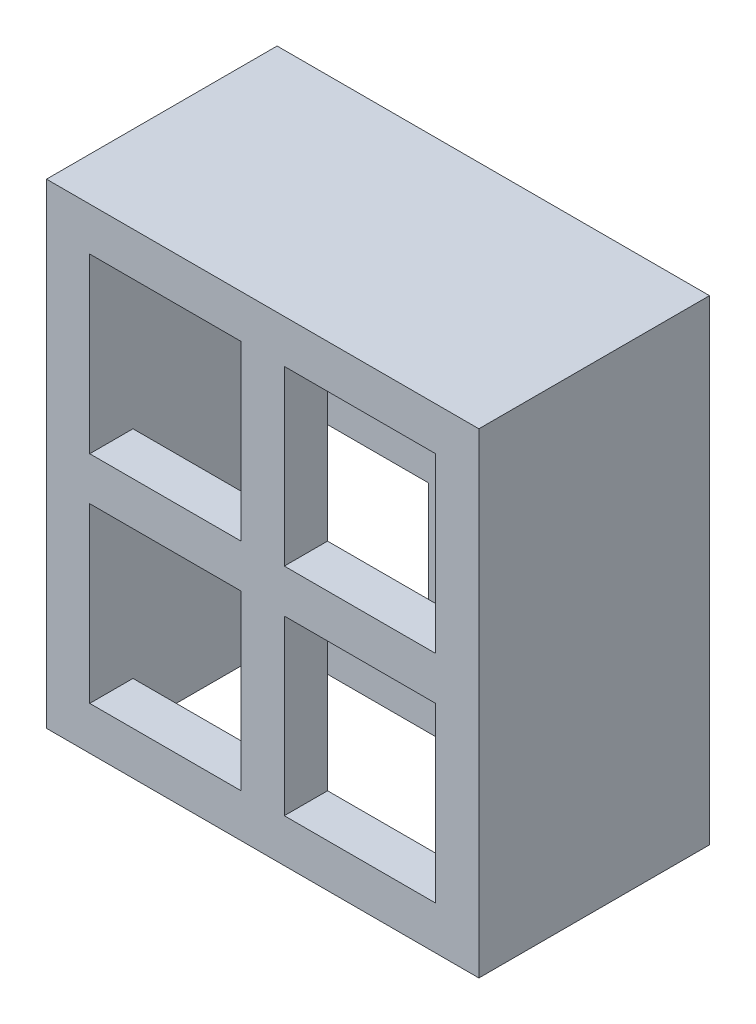
ISO-10303-21;
HEADER;
FILE_DESCRIPTION(('STEP AP214'),'2;1');
FILE_NAME('part.step','',(''),(''),'','','');
FILE_SCHEMA(('AUTOMOTIVE_DESIGN { 1 0 10303 214 1 1 1 1 }'));
ENDSEC;
DATA;
#1=APPLICATION_CONTEXT('core data for automotive mechanical design processes');
#2=APPLICATION_PROTOCOL_DEFINITION('international standard','automotive_design',2000,#1);
#3=PRODUCT_CONTEXT('',#1,'mechanical');
#4=PRODUCT('Part','Part','',(#3));
#5=PRODUCT_RELATED_PRODUCT_CATEGORY('part','',(#4));
#6=PRODUCT_DEFINITION_FORMATION('','',#4);
#7=PRODUCT_DEFINITION_CONTEXT('part definition',#1,'design');
#8=PRODUCT_DEFINITION('design','',#6,#7);
#9=PRODUCT_DEFINITION_SHAPE('','',#8);
#10=(LENGTH_UNIT() NAMED_UNIT(*) SI_UNIT(.MILLI.,.METRE.));
#11=(NAMED_UNIT(*) PLANE_ANGLE_UNIT() SI_UNIT($,.RADIAN.));
#12=(NAMED_UNIT(*) SI_UNIT($,.STERADIAN.) SOLID_ANGLE_UNIT());
#13=UNCERTAINTY_MEASURE_WITH_UNIT(LENGTH_MEASURE(1.E-05),#10,'distance_accuracy_value','');
#14=(GEOMETRIC_REPRESENTATION_CONTEXT(3) GLOBAL_UNCERTAINTY_ASSIGNED_CONTEXT((#13)) GLOBAL_UNIT_ASSIGNED_CONTEXT((#10,
#11,#12)) REPRESENTATION_CONTEXT('',''));
#15=CARTESIAN_POINT('',(0.,0.,0.));
#16=DIRECTION('',(0.,0.,1.));
#17=DIRECTION('',(1.,0.,0.));
#18=AXIS2_PLACEMENT_3D('',#15,#16,#17);
#19=CARTESIAN_POINT('',(-32.3492358096452,16.5,22.6983026995238));
#20=DIRECTION('',(0.,0.,1.));
#21=DIRECTION('',(1.,0.,0.));
#22=AXIS2_PLACEMENT_3D('',#19,#20,#21);
#23=PLANE('',#22);
#24=DIRECTION('',(0.,-1.,0.));
#25=VECTOR('',#24,1.);
#26=CARTESIAN_POINT('',(-20.3492358096452,16.5,22.6983026995238));
#27=LINE('',#26,#25);
#28=CARTESIAN_POINT('',(-20.3492358096452,3.,22.6983026995238));
#29=VERTEX_POINT('',#28);
#30=CARTESIAN_POINT('',(-20.3492358096452,1.5,22.6983026995238));
#31=VERTEX_POINT('',#30);
#32=EDGE_CURVE('E441',#29,#31,#27,.T.);
#33=ORIENTED_EDGE('',*,*,#32,.T.);
#34=DIRECTION('',(-1.,0.,0.));
#35=VECTOR('',#34,1.);
#36=CARTESIAN_POINT('',(-32.3492358096452,1.5,22.6983026995238));
#37=LINE('',#36,#35);
#38=CARTESIAN_POINT('',(-32.3492358096452,1.5,22.6983026995238));
#39=VERTEX_POINT('',#38);
#40=EDGE_CURVE('E287',#31,#39,#37,.T.);
#41=ORIENTED_EDGE('',*,*,#40,.T.);
#42=DIRECTION('',(0.,-1.,0.));
#43=VECTOR('',#42,1.);
#44=CARTESIAN_POINT('',(-32.3492358096452,16.5,22.6983026995238));
#45=LINE('',#44,#43);
#46=CARTESIAN_POINT('',(-32.3492358096452,3.,22.6983026995238));
#47=VERTEX_POINT('',#46);
#48=EDGE_CURVE('E437',#47,#39,#45,.T.);
#49=ORIENTED_EDGE('',*,*,#48,.F.);
#50=DIRECTION('',(1.,0.,0.));
#51=VECTOR('',#50,1.);
#52=CARTESIAN_POINT('',(-32.3492358096452,3.,22.6983026995238));
#53=LINE('',#52,#51);
#54=CARTESIAN_POINT('',(-27.0992358096452,3.,22.6983026995238));
#55=VERTEX_POINT('',#54);
#56=EDGE_CURVE('E417',#47,#55,#53,.T.);
#57=ORIENTED_EDGE('',*,*,#56,.T.);
#58=DIRECTION('',(0.,1.,0.));
#59=VECTOR('',#58,1.);
#60=CARTESIAN_POINT('',(-27.0992358096452,16.5,22.6983026995238));
#61=LINE('',#60,#59);
#62=CARTESIAN_POINT('',(-27.0992358096452,9.,22.6983026995238));
#63=VERTEX_POINT('',#62);
#64=EDGE_CURVE('E420',#55,#63,#61,.T.);
#65=ORIENTED_EDGE('',*,*,#64,.T.);
#66=DIRECTION('',(-1.,0.,0.));
#67=VECTOR('',#66,1.);
#68=CARTESIAN_POINT('',(-32.3492358096452,9.,22.6983026995238));
#69=LINE('',#68,#67);
#70=CARTESIAN_POINT('',(-32.3492358096452,9.,22.6983026995238));
#71=VERTEX_POINT('',#70);
#72=EDGE_CURVE('E423',#63,#71,#69,.T.);
#73=ORIENTED_EDGE('',*,*,#72,.T.);
#74=CARTESIAN_POINT('',(-32.3492358096452,10.5,22.6983026995238));
#75=VERTEX_POINT('',#74);
#76=EDGE_CURVE('E439',#75,#71,#45,.T.);
#77=ORIENTED_EDGE('',*,*,#76,.F.);
#78=DIRECTION('',(1.,0.,0.));
#79=VECTOR('',#78,1.);
#80=CARTESIAN_POINT('',(-32.3492358096452,10.5,22.6983026995238));
#81=LINE('',#80,#79);
#82=CARTESIAN_POINT('',(-27.0992358096452,10.5,22.6983026995238));
#83=VERTEX_POINT('',#82);
#84=EDGE_CURVE('E402',#75,#83,#81,.T.);
#85=ORIENTED_EDGE('',*,*,#84,.T.);
#86=DIRECTION('',(0.,1.,0.));
#87=VECTOR('',#86,1.);
#88=CARTESIAN_POINT('',(-27.0992358096452,16.5,22.6983026995238));
#89=LINE('',#88,#87);
#90=CARTESIAN_POINT('',(-27.0992358096452,16.5,22.6983026995238));
#91=VERTEX_POINT('',#90);
#92=EDGE_CURVE('E393',#83,#91,#89,.T.);
#93=ORIENTED_EDGE('',*,*,#92,.T.);
#94=DIRECTION('',(-1.,0.,0.));
#95=VECTOR('',#94,1.);
#96=CARTESIAN_POINT('',(-32.3492358096452,16.5,22.6983026995238));
#97=LINE('',#96,#95);
#98=CARTESIAN_POINT('',(-25.5992358096452,16.5,22.6983026995238));
#99=VERTEX_POINT('',#98);
#100=EDGE_CURVE('E433',#99,#91,#97,.T.);
#101=ORIENTED_EDGE('',*,*,#100,.F.);
#102=DIRECTION('',(0.,-1.,0.));
#103=VECTOR('',#102,1.);
#104=CARTESIAN_POINT('',(-25.5992358096452,16.5,22.6983026995238));
#105=LINE('',#104,#103);
#106=CARTESIAN_POINT('',(-25.5992358096452,10.5,22.6983026995238));
#107=VERTEX_POINT('',#106);
#108=EDGE_CURVE('E399',#99,#107,#105,.T.);
#109=ORIENTED_EDGE('',*,*,#108,.T.);
#110=DIRECTION('',(1.,0.,0.));
#111=VECTOR('',#110,1.);
#112=CARTESIAN_POINT('',(-32.3492358096452,10.5,22.6983026995238));
#113=LINE('',#112,#111);
#114=CARTESIAN_POINT('',(-20.3492358096452,10.5,22.6983026995238));
#115=VERTEX_POINT('',#114);
#116=EDGE_CURVE('E405',#107,#115,#113,.T.);
#117=ORIENTED_EDGE('',*,*,#116,.T.);
#118=CARTESIAN_POINT('',(-20.3492358096452,9.,22.6983026995238));
#119=VERTEX_POINT('',#118);
#120=EDGE_CURVE('E440',#115,#119,#27,.T.);
#121=ORIENTED_EDGE('',*,*,#120,.T.);
#122=DIRECTION('',(-1.,0.,0.));
#123=VECTOR('',#122,1.);
#124=CARTESIAN_POINT('',(-32.3492358096452,9.,22.6983026995238));
#125=LINE('',#124,#123);
#126=CARTESIAN_POINT('',(-25.5992358096452,9.,22.6983026995238));
#127=VERTEX_POINT('',#126);
#128=EDGE_CURVE('E411',#119,#127,#125,.T.);
#129=ORIENTED_EDGE('',*,*,#128,.T.);
#130=DIRECTION('',(0.,-1.,0.));
#131=VECTOR('',#130,1.);
#132=CARTESIAN_POINT('',(-25.5992358096452,16.5,22.6983026995238));
#133=LINE('',#132,#131);
#134=CARTESIAN_POINT('',(-25.5992358096452,3.,22.6983026995238));
#135=VERTEX_POINT('',#134);
#136=EDGE_CURVE('E414',#127,#135,#133,.T.);
#137=ORIENTED_EDGE('',*,*,#136,.T.);
#138=DIRECTION('',(1.,0.,0.));
#139=VECTOR('',#138,1.);
#140=CARTESIAN_POINT('',(-32.3492358096452,3.,22.6983026995238));
#141=LINE('',#140,#139);
#142=EDGE_CURVE('E408',#135,#29,#141,.T.);
#143=ORIENTED_EDGE('',*,*,#142,.T.);
#144=EDGE_LOOP('',(#33,#41,#49,#57,#65,#73,#77,#85,#93,#101,#109,#117,#121,#129,#137,#143));
#145=FACE_BOUND('',#144,.T.);
#146=ADVANCED_FACE('F33',(#145),#23,.F.);
#147=CARTESIAN_POINT('',(-32.3492358096452,16.5,17.6983026995238));
#148=DIRECTION('',(0.,0.,-1.));
#149=DIRECTION('',(-1.,0.,0.));
#150=AXIS2_PLACEMENT_3D('',#147,#148,#149);
#151=PLANE('',#150);
#152=DIRECTION('',(0.,-1.,0.));
#153=VECTOR('',#152,1.);
#154=CARTESIAN_POINT('',(-32.3492358096452,16.5,17.6983026995238));
#155=LINE('',#154,#153);
#156=CARTESIAN_POINT('',(-32.3492358096452,3.,17.6983026995238));
#157=VERTEX_POINT('',#156);
#158=CARTESIAN_POINT('',(-32.3492358096452,1.5,17.6983026995238));
#159=VERTEX_POINT('',#158);
#160=EDGE_CURVE('E436',#157,#159,#155,.T.);
#161=ORIENTED_EDGE('',*,*,#160,.T.);
#162=DIRECTION('',(1.,0.,0.));
#163=VECTOR('',#162,1.);
#164=CARTESIAN_POINT('',(-32.3492358096452,1.5,17.6983026995238));
#165=LINE('',#164,#163);
#166=CARTESIAN_POINT('',(-20.3492358096452,1.5,17.6983026995238));
#167=VERTEX_POINT('',#166);
#168=EDGE_CURVE('E11',#159,#167,#165,.T.);
#169=ORIENTED_EDGE('',*,*,#168,.T.);
#170=DIRECTION('',(0.,-1.,0.));
#171=VECTOR('',#170,1.);
#172=CARTESIAN_POINT('',(-20.3492358096452,16.5,17.6983026995238));
#173=LINE('',#172,#171);
#174=CARTESIAN_POINT('',(-20.3492358096452,3.,17.6983026995238));
#175=VERTEX_POINT('',#174);
#176=EDGE_CURVE('E445',#175,#167,#173,.T.);
#177=ORIENTED_EDGE('',*,*,#176,.F.);
#178=DIRECTION('',(-1.,0.,0.));
#179=VECTOR('',#178,1.);
#180=CARTESIAN_POINT('',(-32.3492358096452,3.,17.6983026995238));
#181=LINE('',#180,#179);
#182=CARTESIAN_POINT('',(-25.5992358096452,3.,17.6983026995238));
#183=VERTEX_POINT('',#182);
#184=EDGE_CURVE('E304',#175,#183,#181,.T.);
#185=ORIENTED_EDGE('',*,*,#184,.T.);
#186=DIRECTION('',(0.,1.,0.));
#187=VECTOR('',#186,1.);
#188=CARTESIAN_POINT('',(-25.5992358096452,16.5,17.6983026995238));
#189=LINE('',#188,#187);
#190=CARTESIAN_POINT('',(-25.5992358096452,9.,17.6983026995238));
#191=VERTEX_POINT('',#190);
#192=EDGE_CURVE('E307',#183,#191,#189,.T.);
#193=ORIENTED_EDGE('',*,*,#192,.T.);
#194=DIRECTION('',(1.,0.,0.));
#195=VECTOR('',#194,1.);
#196=CARTESIAN_POINT('',(-32.3492358096452,9.,17.6983026995238));
#197=LINE('',#196,#195);
#198=CARTESIAN_POINT('',(-20.3492358096452,9.,17.6983026995238));
#199=VERTEX_POINT('',#198);
#200=EDGE_CURVE('E310',#191,#199,#197,.T.);
#201=ORIENTED_EDGE('',*,*,#200,.T.);
#202=CARTESIAN_POINT('',(-20.3492358096452,10.5,17.6983026995238));
#203=VERTEX_POINT('',#202);
#204=EDGE_CURVE('E444',#203,#199,#173,.T.);
#205=ORIENTED_EDGE('',*,*,#204,.F.);
#206=DIRECTION('',(-1.,0.,0.));
#207=VECTOR('',#206,1.);
#208=CARTESIAN_POINT('',(-32.3492358096452,10.5,17.6983026995238));
#209=LINE('',#208,#207);
#210=CARTESIAN_POINT('',(-25.5992358096452,10.5,17.6983026995238));
#211=VERTEX_POINT('',#210);
#212=EDGE_CURVE('E301',#203,#211,#209,.T.);
#213=ORIENTED_EDGE('',*,*,#212,.T.);
#214=DIRECTION('',(0.,1.,0.));
#215=VECTOR('',#214,1.);
#216=CARTESIAN_POINT('',(-25.5992358096452,16.5,17.6983026995238));
#217=LINE('',#216,#215);
#218=CARTESIAN_POINT('',(-25.5992358096452,16.5,17.6983026995238));
#219=VERTEX_POINT('',#218);
#220=EDGE_CURVE('E396',#211,#219,#217,.T.);
#221=ORIENTED_EDGE('',*,*,#220,.T.);
#222=DIRECTION('',(1.,0.,0.));
#223=VECTOR('',#222,1.);
#224=CARTESIAN_POINT('',(-32.3492358096452,16.5,17.6983026995238));
#225=LINE('',#224,#223);
#226=CARTESIAN_POINT('',(-27.0992358096452,16.5,17.6983026995238));
#227=VERTEX_POINT('',#226);
#228=EDGE_CURVE('E428',#227,#219,#225,.T.);
#229=ORIENTED_EDGE('',*,*,#228,.F.);
#230=DIRECTION('',(0.,-1.,0.));
#231=VECTOR('',#230,1.);
#232=CARTESIAN_POINT('',(-27.0992358096452,16.5,17.6983026995238));
#233=LINE('',#232,#231);
#234=CARTESIAN_POINT('',(-27.0992358096452,10.5,17.6983026995238));
#235=VERTEX_POINT('',#234);
#236=EDGE_CURVE('E383',#227,#235,#233,.T.);
#237=ORIENTED_EDGE('',*,*,#236,.T.);
#238=DIRECTION('',(-1.,0.,0.));
#239=VECTOR('',#238,1.);
#240=CARTESIAN_POINT('',(-32.3492358096452,10.5,17.6983026995238));
#241=LINE('',#240,#239);
#242=CARTESIAN_POINT('',(-32.3492358096452,10.5,17.6983026995238));
#243=VERTEX_POINT('',#242);
#244=EDGE_CURVE('E293',#235,#243,#241,.T.);
#245=ORIENTED_EDGE('',*,*,#244,.T.);
#246=CARTESIAN_POINT('',(-32.3492358096452,9.,17.6983026995238));
#247=VERTEX_POINT('',#246);
#248=EDGE_CURVE('E324',#243,#247,#155,.T.);
#249=ORIENTED_EDGE('',*,*,#248,.T.);
#250=DIRECTION('',(1.,0.,0.));
#251=VECTOR('',#250,1.);
#252=CARTESIAN_POINT('',(-32.3492358096452,9.,17.6983026995238));
#253=LINE('',#252,#251);
#254=CARTESIAN_POINT('',(-27.0992358096452,9.,17.6983026995238));
#255=VERTEX_POINT('',#254);
#256=EDGE_CURVE('E41',#247,#255,#253,.T.);
#257=ORIENTED_EDGE('',*,*,#256,.T.);
#258=DIRECTION('',(0.,-1.,0.));
#259=VECTOR('',#258,1.);
#260=CARTESIAN_POINT('',(-27.0992358096452,16.5,17.6983026995238));
#261=LINE('',#260,#259);
#262=CARTESIAN_POINT('',(-27.0992358096452,3.,17.6983026995238));
#263=VERTEX_POINT('',#262);
#264=EDGE_CURVE('E316',#255,#263,#261,.T.);
#265=ORIENTED_EDGE('',*,*,#264,.T.);
#266=DIRECTION('',(-1.,0.,0.));
#267=VECTOR('',#266,1.);
#268=CARTESIAN_POINT('',(-32.3492358096452,3.,17.6983026995238));
#269=LINE('',#268,#267);
#270=EDGE_CURVE('E313',#263,#157,#269,.T.);
#271=ORIENTED_EDGE('',*,*,#270,.T.);
#272=EDGE_LOOP('',(#161,#169,#177,#185,#193,#201,#205,#213,#221,#229,#237,#245,#249,#257,#265,#271));
#273=FACE_BOUND('',#272,.T.);
#274=ADVANCED_FACE('F322',(#273),#151,.F.);
#275=CARTESIAN_POINT('',(-33.8492358096452,18.,24.1983026995238));
#276=DIRECTION('',(1.,0.,0.));
#277=DIRECTION('',(0.,0.,-1.));
#278=AXIS2_PLACEMENT_3D('',#275,#276,#277);
#279=PLANE('',#278);
#280=DIRECTION('',(0.,-1.,0.));
#281=VECTOR('',#280,1.);
#282=CARTESIAN_POINT('',(-33.8492358096452,18.,16.1983026995238));
#283=LINE('',#282,#281);
#284=CARTESIAN_POINT('',(-33.8492358096452,18.,16.1983026995238));
#285=VERTEX_POINT('',#284);
#286=CARTESIAN_POINT('',(-33.8492358096452,1.5,16.1983026995238));
#287=VERTEX_POINT('',#286);
#288=EDGE_CURVE('E295',#285,#287,#283,.T.);
#289=ORIENTED_EDGE('',*,*,#288,.T.);
#290=DIRECTION('',(0.,0.,1.));
#291=VECTOR('',#290,1.);
#292=CARTESIAN_POINT('',(-33.8492358096452,1.5,22.6983026995238));
#293=LINE('',#292,#291);
#294=CARTESIAN_POINT('',(-33.8492358096452,1.5,24.1983026995238));
#295=VERTEX_POINT('',#294);
#296=EDGE_CURVE('E278',#287,#295,#293,.T.);
#297=ORIENTED_EDGE('',*,*,#296,.T.);
#298=DIRECTION('',(0.,-1.,0.));
#299=VECTOR('',#298,1.);
#300=CARTESIAN_POINT('',(-33.8492358096452,18.,24.1983026995238));
#301=LINE('',#300,#299);
#302=CARTESIAN_POINT('',(-33.8492358096452,18.,24.1983026995238));
#303=VERTEX_POINT('',#302);
#304=EDGE_CURVE('E286',#303,#295,#301,.T.);
#305=ORIENTED_EDGE('',*,*,#304,.F.);
#306=DIRECTION('',(0.,0.,1.));
#307=VECTOR('',#306,1.);
#308=CARTESIAN_POINT('',(-33.8492358096452,18.,24.1983026995238));
#309=LINE('',#308,#307);
#310=EDGE_CURVE('E449',#285,#303,#309,.T.);
#311=ORIENTED_EDGE('',*,*,#310,.F.);
#312=EDGE_LOOP('',(#289,#297,#305,#311));
#313=FACE_BOUND('',#312,.T.);
#314=ADVANCED_FACE('F35',(#313),#279,.F.);
#315=CARTESIAN_POINT('',(-33.8492358096452,18.,24.1983026995238));
#316=DIRECTION('',(0.,0.,-1.));
#317=DIRECTION('',(-1.,0.,0.));
#318=AXIS2_PLACEMENT_3D('',#315,#316,#317);
#319=PLANE('',#318);
#320=DIRECTION('',(1.,0.,0.));
#321=VECTOR('',#320,1.);
#322=CARTESIAN_POINT('',(-32.3492358096452,3.,24.1983026995238));
#323=LINE('',#322,#321);
#324=CARTESIAN_POINT('',(-32.3492358096452,3.,24.1983026995238));
#325=VERTEX_POINT('',#324);
#326=CARTESIAN_POINT('',(-27.0992358096452,3.,24.1983026995238));
#327=VERTEX_POINT('',#326);
#328=EDGE_CURVE('E549',#325,#327,#323,.T.);
#329=ORIENTED_EDGE('',*,*,#328,.F.);
#330=DIRECTION('',(0.,-1.,0.));
#331=VECTOR('',#330,1.);
#332=CARTESIAN_POINT('',(-32.3492358096452,9.,24.1983026995238));
#333=LINE('',#332,#331);
#334=CARTESIAN_POINT('',(-32.3492358096452,9.,24.1983026995238));
#335=VERTEX_POINT('',#334);
#336=EDGE_CURVE('E48',#335,#325,#333,.T.);
#337=ORIENTED_EDGE('',*,*,#336,.F.);
#338=DIRECTION('',(-1.,0.,0.));
#339=VECTOR('',#338,1.);
#340=CARTESIAN_POINT('',(-32.3492358096452,9.,24.1983026995238));
#341=LINE('',#340,#339);
#342=CARTESIAN_POINT('',(-27.0992358096452,9.,24.1983026995238));
#343=VERTEX_POINT('',#342);
#344=EDGE_CURVE('E344',#343,#335,#341,.T.);
#345=ORIENTED_EDGE('',*,*,#344,.F.);
#346=DIRECTION('',(0.,1.,0.));
#347=VECTOR('',#346,1.);
#348=CARTESIAN_POINT('',(-27.0992358096452,9.,24.1983026995238));
#349=LINE('',#348,#347);
#350=EDGE_CURVE('E551',#327,#343,#349,.T.);
#351=ORIENTED_EDGE('',*,*,#350,.F.);
#352=EDGE_LOOP('',(#329,#337,#345,#351));
#353=FACE_BOUND('',#352,.T.);
#354=DIRECTION('',(1.,0.,0.));
#355=VECTOR('',#354,1.);
#356=CARTESIAN_POINT('',(-25.5992358096452,3.,24.1983026995238));
#357=LINE('',#356,#355);
#358=CARTESIAN_POINT('',(-25.5992358096452,3.,24.1983026995238));
#359=VERTEX_POINT('',#358);
#360=CARTESIAN_POINT('',(-20.3492358096452,3.,24.1983026995238));
#361=VERTEX_POINT('',#360);
#362=EDGE_CURVE('E340',#359,#361,#357,.T.);
#363=ORIENTED_EDGE('',*,*,#362,.F.);
#364=DIRECTION('',(0.,-1.,0.));
#365=VECTOR('',#364,1.);
#366=CARTESIAN_POINT('',(-25.5992358096452,9.,24.1983026995238));
#367=LINE('',#366,#365);
#368=CARTESIAN_POINT('',(-25.5992358096452,9.,24.1983026995238));
#369=VERTEX_POINT('',#368);
#370=EDGE_CURVE('E56',#369,#359,#367,.T.);
#371=ORIENTED_EDGE('',*,*,#370,.F.);
#372=DIRECTION('',(-1.,0.,0.));
#373=VECTOR('',#372,1.);
#374=CARTESIAN_POINT('',(-25.5992358096452,9.,24.1983026995238));
#375=LINE('',#374,#373);
#376=CARTESIAN_POINT('',(-20.3492358096452,9.,24.1983026995238));
#377=VERTEX_POINT('',#376);
#378=EDGE_CURVE('E510',#377,#369,#375,.T.);
#379=ORIENTED_EDGE('',*,*,#378,.F.);
#380=DIRECTION('',(0.,1.,0.));
#381=VECTOR('',#380,1.);
#382=CARTESIAN_POINT('',(-20.3492358096452,9.,24.1983026995238));
#383=LINE('',#382,#381);
#384=EDGE_CURVE('E522',#361,#377,#383,.T.);
#385=ORIENTED_EDGE('',*,*,#384,.F.);
#386=EDGE_LOOP('',(#363,#371,#379,#385));
#387=FACE_BOUND('',#386,.T.);
#388=DIRECTION('',(1.,0.,0.));
#389=VECTOR('',#388,1.);
#390=CARTESIAN_POINT('',(-25.5992358096452,10.5,24.1983026995238));
#391=LINE('',#390,#389);
#392=CARTESIAN_POINT('',(-25.5992358096452,10.5,24.1983026995238));
#393=VERTEX_POINT('',#392);
#394=CARTESIAN_POINT('',(-20.3492358096452,10.5,24.1983026995238));
#395=VERTEX_POINT('',#394);
#396=EDGE_CURVE('E489',#393,#395,#391,.T.);
#397=ORIENTED_EDGE('',*,*,#396,.F.);
#398=DIRECTION('',(0.,-1.,0.));
#399=VECTOR('',#398,1.);
#400=CARTESIAN_POINT('',(-25.5992358096452,16.5,24.1983026995238));
#401=LINE('',#400,#399);
#402=CARTESIAN_POINT('',(-25.5992358096452,16.5,24.1983026995238));
#403=VERTEX_POINT('',#402);
#404=EDGE_CURVE('E487',#403,#393,#401,.T.);
#405=ORIENTED_EDGE('',*,*,#404,.F.);
#406=DIRECTION('',(-1.,0.,0.));
#407=VECTOR('',#406,1.);
#408=CARTESIAN_POINT('',(-25.5992358096452,16.5,24.1983026995238));
#409=LINE('',#408,#407);
#410=CARTESIAN_POINT('',(-20.3492358096452,16.5,24.1983026995238));
#411=VERTEX_POINT('',#410);
#412=EDGE_CURVE('E477',#411,#403,#409,.T.);
#413=ORIENTED_EDGE('',*,*,#412,.F.);
#414=DIRECTION('',(0.,1.,0.));
#415=VECTOR('',#414,1.);
#416=CARTESIAN_POINT('',(-20.3492358096452,16.5,24.1983026995238));
#417=LINE('',#416,#415);
#418=EDGE_CURVE('E493',#395,#411,#417,.T.);
#419=ORIENTED_EDGE('',*,*,#418,.F.);
#420=EDGE_LOOP('',(#397,#405,#413,#419));
#421=FACE_BOUND('',#420,.T.);
#422=DIRECTION('',(1.,0.,0.));
#423=VECTOR('',#422,1.);
#424=CARTESIAN_POINT('',(-32.3492358096452,10.5,24.1983026995238));
#425=LINE('',#424,#423);
#426=CARTESIAN_POINT('',(-32.3492358096452,10.5,24.1983026995238));
#427=VERTEX_POINT('',#426);
#428=CARTESIAN_POINT('',(-27.0992358096452,10.5,24.1983026995238));
#429=VERTEX_POINT('',#428);
#430=EDGE_CURVE('E371',#427,#429,#425,.T.);
#431=ORIENTED_EDGE('',*,*,#430,.F.);
#432=DIRECTION('',(0.,-1.,0.));
#433=VECTOR('',#432,1.);
#434=CARTESIAN_POINT('',(-32.3492358096452,16.5,24.1983026995238));
#435=LINE('',#434,#433);
#436=CARTESIAN_POINT('',(-32.3492358096452,16.5,24.1983026995238));
#437=VERTEX_POINT('',#436);
#438=EDGE_CURVE('E369',#437,#427,#435,.T.);
#439=ORIENTED_EDGE('',*,*,#438,.F.);
#440=DIRECTION('',(-1.,0.,0.));
#441=VECTOR('',#440,1.);
#442=CARTESIAN_POINT('',(-32.3492358096452,16.5,24.1983026995238));
#443=LINE('',#442,#441);
#444=CARTESIAN_POINT('',(-27.0992358096452,16.5,24.1983026995238));
#445=VERTEX_POINT('',#444);
#446=EDGE_CURVE('E359',#445,#437,#443,.T.);
#447=ORIENTED_EDGE('',*,*,#446,.F.);
#448=DIRECTION('',(0.,1.,0.));
#449=VECTOR('',#448,1.);
#450=CARTESIAN_POINT('',(-27.0992358096452,16.5,24.1983026995238));
#451=LINE('',#450,#449);
#452=EDGE_CURVE('E375',#429,#445,#451,.T.);
#453=ORIENTED_EDGE('',*,*,#452,.F.);
#454=EDGE_LOOP('',(#431,#439,#447,#453));
#455=FACE_BOUND('',#454,.T.);
#456=ORIENTED_EDGE('',*,*,#304,.T.);
#457=DIRECTION('',(-1.,0.,0.));
#458=VECTOR('',#457,1.);
#459=CARTESIAN_POINT('',(-32.3492358096452,1.5,24.1983026995238));
#460=LINE('',#459,#458);
#461=CARTESIAN_POINT('',(-18.8492358096452,1.5,24.1983026995238));
#462=VERTEX_POINT('',#461);
#463=EDGE_CURVE('E270',#462,#295,#460,.T.);
#464=ORIENTED_EDGE('',*,*,#463,.F.);
#465=DIRECTION('',(0.,-1.,0.));
#466=VECTOR('',#465,1.);
#467=CARTESIAN_POINT('',(-18.8492358096452,18.,24.1983026995238));
#468=LINE('',#467,#466);
#469=CARTESIAN_POINT('',(-18.8492358096452,18.,24.1983026995238));
#470=VERTEX_POINT('',#469);
#471=EDGE_CURVE('E283',#470,#462,#468,.T.);
#472=ORIENTED_EDGE('',*,*,#471,.F.);
#473=DIRECTION('',(1.,0.,0.));
#474=VECTOR('',#473,1.);
#475=CARTESIAN_POINT('',(-33.8492358096452,18.,24.1983026995238));
#476=LINE('',#475,#474);
#477=EDGE_CURVE('E452',#303,#470,#476,.T.);
#478=ORIENTED_EDGE('',*,*,#477,.F.);
#479=EDGE_LOOP('',(#456,#464,#472,#478));
#480=FACE_BOUND('',#479,.T.);
#481=ADVANCED_FACE('F282',(#353,#387,#421,#455,#480),#319,.F.);
#482=CARTESIAN_POINT('',(-18.8492358096452,18.,24.1983026995238));
#483=DIRECTION('',(-1.,0.,0.));
#484=DIRECTION('',(0.,0.,1.));
#485=AXIS2_PLACEMENT_3D('',#482,#483,#484);
#486=PLANE('',#485);
#487=ORIENTED_EDGE('',*,*,#471,.T.);
#488=DIRECTION('',(0.,0.,1.));
#489=VECTOR('',#488,1.);
#490=CARTESIAN_POINT('',(-18.8492358096452,1.5,22.6983026995238));
#491=LINE('',#490,#489);
#492=CARTESIAN_POINT('',(-18.8492358096452,1.5,16.1983026995238));
#493=VERTEX_POINT('',#492);
#494=EDGE_CURVE('E267',#493,#462,#491,.T.);
#495=ORIENTED_EDGE('',*,*,#494,.F.);
#496=DIRECTION('',(0.,-1.,0.));
#497=VECTOR('',#496,1.);
#498=CARTESIAN_POINT('',(-18.8492358096452,18.,16.1983026995238));
#499=LINE('',#498,#497);
#500=CARTESIAN_POINT('',(-18.8492358096452,18.,16.1983026995238));
#501=VERTEX_POINT('',#500);
#502=EDGE_CURVE('E291',#501,#493,#499,.T.);
#503=ORIENTED_EDGE('',*,*,#502,.F.);
#504=DIRECTION('',(0.,0.,-1.));
#505=VECTOR('',#504,1.);
#506=CARTESIAN_POINT('',(-18.8492358096452,18.,24.1983026995238));
#507=LINE('',#506,#505);
#508=EDGE_CURVE('E290',#470,#501,#507,.T.);
#509=ORIENTED_EDGE('',*,*,#508,.F.);
#510=EDGE_LOOP('',(#487,#495,#503,#509));
#511=FACE_BOUND('',#510,.T.);
#512=ADVANCED_FACE('F289',(#511),#486,.F.);
#513=CARTESIAN_POINT('',(-33.8492358096452,18.,16.1983026995238));
#514=DIRECTION('',(0.,0.,1.));
#515=DIRECTION('',(1.,0.,0.));
#516=AXIS2_PLACEMENT_3D('',#513,#514,#515);
#517=PLANE('',#516);
#518=DIRECTION('',(-1.,0.,0.));
#519=VECTOR('',#518,1.);
#520=CARTESIAN_POINT('',(-32.3492358096452,9.,16.1983026995238));
#521=LINE('',#520,#519);
#522=CARTESIAN_POINT('',(-27.0992358096452,9.,16.1983026995238));
#523=VERTEX_POINT('',#522);
#524=CARTESIAN_POINT('',(-32.3492358096452,9.,16.1983026995238));
#525=VERTEX_POINT('',#524);
#526=EDGE_CURVE('E546',#523,#525,#521,.T.);
#527=ORIENTED_EDGE('',*,*,#526,.T.);
#528=DIRECTION('',(0.,-1.,0.));
#529=VECTOR('',#528,1.);
#530=CARTESIAN_POINT('',(-32.3492358096452,9.,16.1983026995238));
#531=LINE('',#530,#529);
#532=CARTESIAN_POINT('',(-32.3492358096452,3.,16.1983026995238));
#533=VERTEX_POINT('',#532);
#534=EDGE_CURVE('E336',#525,#533,#531,.T.);
#535=ORIENTED_EDGE('',*,*,#534,.T.);
#536=DIRECTION('',(1.,0.,0.));
#537=VECTOR('',#536,1.);
#538=CARTESIAN_POINT('',(-32.3492358096452,3.,16.1983026995238));
#539=LINE('',#538,#537);
#540=CARTESIAN_POINT('',(-27.0992358096452,3.,16.1983026995238));
#541=VERTEX_POINT('',#540);
#542=EDGE_CURVE('E540',#533,#541,#539,.T.);
#543=ORIENTED_EDGE('',*,*,#542,.T.);
#544=DIRECTION('',(0.,1.,0.));
#545=VECTOR('',#544,1.);
#546=CARTESIAN_POINT('',(-27.0992358096452,9.,16.1983026995238));
#547=LINE('',#546,#545);
#548=EDGE_CURVE('E543',#541,#523,#547,.T.);
#549=ORIENTED_EDGE('',*,*,#548,.T.);
#550=EDGE_LOOP('',(#527,#535,#543,#549));
#551=FACE_BOUND('',#550,.T.);
#552=DIRECTION('',(-1.,0.,0.));
#553=VECTOR('',#552,1.);
#554=CARTESIAN_POINT('',(-25.5992358096452,9.,16.1983026995238));
#555=LINE('',#554,#553);
#556=CARTESIAN_POINT('',(-20.3492358096452,9.,16.1983026995238));
#557=VERTEX_POINT('',#556);
#558=CARTESIAN_POINT('',(-25.5992358096452,9.,16.1983026995238));
#559=VERTEX_POINT('',#558);
#560=EDGE_CURVE('E516',#557,#559,#555,.T.);
#561=ORIENTED_EDGE('',*,*,#560,.T.);
#562=DIRECTION('',(0.,-1.,0.));
#563=VECTOR('',#562,1.);
#564=CARTESIAN_POINT('',(-25.5992358096452,9.,16.1983026995238));
#565=LINE('',#564,#563);
#566=CARTESIAN_POINT('',(-25.5992358096452,3.,16.1983026995238));
#567=VERTEX_POINT('',#566);
#568=EDGE_CURVE('E506',#559,#567,#565,.T.);
#569=ORIENTED_EDGE('',*,*,#568,.T.);
#570=DIRECTION('',(1.,0.,0.));
#571=VECTOR('',#570,1.);
#572=CARTESIAN_POINT('',(-25.5992358096452,3.,16.1983026995238));
#573=LINE('',#572,#571);
#574=CARTESIAN_POINT('',(-20.3492358096452,3.,16.1983026995238));
#575=VERTEX_POINT('',#574);
#576=EDGE_CURVE('E509',#567,#575,#573,.T.);
#577=ORIENTED_EDGE('',*,*,#576,.T.);
#578=DIRECTION('',(0.,1.,0.));
#579=VECTOR('',#578,1.);
#580=CARTESIAN_POINT('',(-20.3492358096452,9.,16.1983026995238));
#581=LINE('',#580,#579);
#582=EDGE_CURVE('E513',#575,#557,#581,.T.);
#583=ORIENTED_EDGE('',*,*,#582,.T.);
#584=EDGE_LOOP('',(#561,#569,#577,#583));
#585=FACE_BOUND('',#584,.T.);
#586=DIRECTION('',(-1.,0.,0.));
#587=VECTOR('',#586,1.);
#588=CARTESIAN_POINT('',(-25.5992358096452,16.5,16.1983026995238));
#589=LINE('',#588,#587);
#590=CARTESIAN_POINT('',(-20.3492358096452,16.5,16.1983026995238));
#591=VERTEX_POINT('',#590);
#592=CARTESIAN_POINT('',(-25.5992358096452,16.5,16.1983026995238));
#593=VERTEX_POINT('',#592);
#594=EDGE_CURVE('E483',#591,#593,#589,.T.);
#595=ORIENTED_EDGE('',*,*,#594,.T.);
#596=DIRECTION('',(0.,-1.,0.));
#597=VECTOR('',#596,1.);
#598=CARTESIAN_POINT('',(-25.5992358096452,16.5,16.1983026995238));
#599=LINE('',#598,#597);
#600=CARTESIAN_POINT('',(-25.5992358096452,10.5,16.1983026995238));
#601=VERTEX_POINT('',#600);
#602=EDGE_CURVE('E473',#593,#601,#599,.T.);
#603=ORIENTED_EDGE('',*,*,#602,.T.);
#604=DIRECTION('',(1.,0.,0.));
#605=VECTOR('',#604,1.);
#606=CARTESIAN_POINT('',(-25.5992358096452,10.5,16.1983026995238));
#607=LINE('',#606,#605);
#608=CARTESIAN_POINT('',(-20.3492358096452,10.5,16.1983026995238));
#609=VERTEX_POINT('',#608);
#610=EDGE_CURVE('E476',#601,#609,#607,.T.);
#611=ORIENTED_EDGE('',*,*,#610,.T.);
#612=DIRECTION('',(0.,1.,0.));
#613=VECTOR('',#612,1.);
#614=CARTESIAN_POINT('',(-20.3492358096452,16.5,16.1983026995238));
#615=LINE('',#614,#613);
#616=EDGE_CURVE('E480',#609,#591,#615,.T.);
#617=ORIENTED_EDGE('',*,*,#616,.T.);
#618=EDGE_LOOP('',(#595,#603,#611,#617));
#619=FACE_BOUND('',#618,.T.);
#620=DIRECTION('',(-1.,0.,0.));
#621=VECTOR('',#620,1.);
#622=CARTESIAN_POINT('',(-32.3492358096452,16.5,16.1983026995238));
#623=LINE('',#622,#621);
#624=CARTESIAN_POINT('',(-27.0992358096452,16.5,16.1983026995238));
#625=VERTEX_POINT('',#624);
#626=CARTESIAN_POINT('',(-32.3492358096452,16.5,16.1983026995238));
#627=VERTEX_POINT('',#626);
#628=EDGE_CURVE('E365',#625,#627,#623,.T.);
#629=ORIENTED_EDGE('',*,*,#628,.T.);
#630=DIRECTION('',(0.,-1.,0.));
#631=VECTOR('',#630,1.);
#632=CARTESIAN_POINT('',(-32.3492358096452,16.5,16.1983026995238));
#633=LINE('',#632,#631);
#634=CARTESIAN_POINT('',(-32.3492358096452,10.5,16.1983026995238));
#635=VERTEX_POINT('',#634);
#636=EDGE_CURVE('E355',#627,#635,#633,.T.);
#637=ORIENTED_EDGE('',*,*,#636,.T.);
#638=DIRECTION('',(1.,0.,0.));
#639=VECTOR('',#638,1.);
#640=CARTESIAN_POINT('',(-32.3492358096452,10.5,16.1983026995238));
#641=LINE('',#640,#639);
#642=CARTESIAN_POINT('',(-27.0992358096452,10.5,16.1983026995238));
#643=VERTEX_POINT('',#642);
#644=EDGE_CURVE('E358',#635,#643,#641,.T.);
#645=ORIENTED_EDGE('',*,*,#644,.T.);
#646=DIRECTION('',(0.,1.,0.));
#647=VECTOR('',#646,1.);
#648=CARTESIAN_POINT('',(-27.0992358096452,16.5,16.1983026995238));
#649=LINE('',#648,#647);
#650=EDGE_CURVE('E362',#643,#625,#649,.T.);
#651=ORIENTED_EDGE('',*,*,#650,.T.);
#652=EDGE_LOOP('',(#629,#637,#645,#651));
#653=FACE_BOUND('',#652,.T.);
#654=ORIENTED_EDGE('',*,*,#502,.T.);
#655=DIRECTION('',(-1.,0.,0.));
#656=VECTOR('',#655,1.);
#657=CARTESIAN_POINT('',(-33.8492358096452,1.5,16.1983026995238));
#658=LINE('',#657,#656);
#659=EDGE_CURVE('E273',#493,#287,#658,.T.);
#660=ORIENTED_EDGE('',*,*,#659,.T.);
#661=ORIENTED_EDGE('',*,*,#288,.F.);
#662=DIRECTION('',(-1.,0.,0.));
#663=VECTOR('',#662,1.);
#664=CARTESIAN_POINT('',(-33.8492358096452,18.,16.1983026995238));
#665=LINE('',#664,#663);
#666=EDGE_CURVE('E455',#501,#285,#665,.T.);
#667=ORIENTED_EDGE('',*,*,#666,.F.);
#668=EDGE_LOOP('',(#654,#660,#661,#667));
#669=FACE_BOUND('',#668,.T.);
#670=ADVANCED_FACE('F462',(#551,#585,#619,#653,#669),#517,.F.);
#671=CARTESIAN_POINT('',(0.,18.,0.));
#672=DIRECTION('',(0.,-1.,0.));
#673=DIRECTION('',(0.,0.,-1.));
#674=AXIS2_PLACEMENT_3D('',#671,#672,#673);
#675=PLANE('',#674);
#676=ORIENTED_EDGE('',*,*,#310,.T.);
#677=ORIENTED_EDGE('',*,*,#477,.T.);
#678=ORIENTED_EDGE('',*,*,#508,.T.);
#679=ORIENTED_EDGE('',*,*,#666,.T.);
#680=EDGE_LOOP('',(#676,#677,#678,#679));
#681=FACE_BOUND('',#680,.T.);
#682=ADVANCED_FACE('F583',(#681),#675,.F.);
#683=CARTESIAN_POINT('',(-32.3492358096452,16.5,22.6983026995238));
#684=DIRECTION('',(-1.,0.,0.));
#685=DIRECTION('',(0.,0.,1.));
#686=AXIS2_PLACEMENT_3D('',#683,#684,#685);
#687=PLANE('',#686);
#688=ORIENTED_EDGE('',*,*,#48,.T.);
#689=DIRECTION('',(0.,0.,-1.));
#690=VECTOR('',#689,1.);
#691=CARTESIAN_POINT('',(-32.3492358096452,1.5,22.6983026995238));
#692=LINE('',#691,#690);
#693=EDGE_CURVE('E470',#39,#159,#692,.T.);
#694=ORIENTED_EDGE('',*,*,#693,.T.);
#695=ORIENTED_EDGE('',*,*,#160,.F.);
#696=DIRECTION('',(0.,0.,1.));
#697=VECTOR('',#696,1.);
#698=CARTESIAN_POINT('',(-32.3492358096452,3.,16.1983026995238));
#699=LINE('',#698,#697);
#700=EDGE_CURVE('E352',#533,#157,#699,.T.);
#701=ORIENTED_EDGE('',*,*,#700,.F.);
#702=ORIENTED_EDGE('',*,*,#534,.F.);
#703=DIRECTION('',(0.,0.,1.));
#704=VECTOR('',#703,1.);
#705=CARTESIAN_POINT('',(-32.3492358096452,9.,16.1983026995238));
#706=LINE('',#705,#704);
#707=EDGE_CURVE('E330',#525,#247,#706,.T.);
#708=ORIENTED_EDGE('',*,*,#707,.T.);
#709=ORIENTED_EDGE('',*,*,#248,.F.);
#710=DIRECTION('',(0.,0.,1.));
#711=VECTOR('',#710,1.);
#712=CARTESIAN_POINT('',(-32.3492358096452,10.5,16.1983026995238));
#713=LINE('',#712,#711);
#714=EDGE_CURVE('E389',#635,#243,#713,.T.);
#715=ORIENTED_EDGE('',*,*,#714,.F.);
#716=ORIENTED_EDGE('',*,*,#636,.F.);
#717=DIRECTION('',(0.,0.,-1.));
#718=VECTOR('',#717,1.);
#719=CARTESIAN_POINT('',(-32.3492358096452,16.5,22.6983026995238));
#720=LINE('',#719,#718);
#721=EDGE_CURVE('E426',#437,#627,#720,.T.);
#722=ORIENTED_EDGE('',*,*,#721,.F.);
#723=ORIENTED_EDGE('',*,*,#438,.T.);
#724=EDGE_CURVE('E368',#75,#427,#713,.T.);
#725=ORIENTED_EDGE('',*,*,#724,.F.);
#726=ORIENTED_EDGE('',*,*,#76,.T.);
#727=EDGE_CURVE('E338',#71,#335,#706,.T.);
#728=ORIENTED_EDGE('',*,*,#727,.T.);
#729=ORIENTED_EDGE('',*,*,#336,.T.);
#730=EDGE_CURVE('E354',#47,#325,#699,.T.);
#731=ORIENTED_EDGE('',*,*,#730,.F.);
#732=EDGE_LOOP('',(#688,#694,#695,#701,#702,#708,#709,#715,#716,#722,#723,#725,#726,#728,#729,#731));
#733=FACE_BOUND('',#732,.T.);
#734=ADVANCED_FACE('F334',(#733),#687,.F.);
#735=CARTESIAN_POINT('',(-20.3492358096452,16.5,22.6983026995238));
#736=DIRECTION('',(1.,0.,0.));
#737=DIRECTION('',(0.,0.,-1.));
#738=AXIS2_PLACEMENT_3D('',#735,#736,#737);
#739=PLANE('',#738);
#740=ORIENTED_EDGE('',*,*,#176,.T.);
#741=DIRECTION('',(0.,0.,1.));
#742=VECTOR('',#741,1.);
#743=CARTESIAN_POINT('',(-20.3492358096452,1.5,22.6983026995238));
#744=LINE('',#743,#742);
#745=EDGE_CURVE('E466',#167,#31,#744,.T.);
#746=ORIENTED_EDGE('',*,*,#745,.T.);
#747=ORIENTED_EDGE('',*,*,#32,.F.);
#748=DIRECTION('',(0.,0.,1.));
#749=VECTOR('',#748,1.);
#750=CARTESIAN_POINT('',(-20.3492358096452,3.,16.1983026995238));
#751=LINE('',#750,#749);
#752=EDGE_CURVE('E536',#29,#361,#751,.T.);
#753=ORIENTED_EDGE('',*,*,#752,.T.);
#754=ORIENTED_EDGE('',*,*,#384,.T.);
#755=DIRECTION('',(0.,0.,1.));
#756=VECTOR('',#755,1.);
#757=CARTESIAN_POINT('',(-20.3492358096452,9.,16.1983026995238));
#758=LINE('',#757,#756);
#759=EDGE_CURVE('E532',#119,#377,#758,.T.);
#760=ORIENTED_EDGE('',*,*,#759,.F.);
#761=ORIENTED_EDGE('',*,*,#120,.F.);
#762=DIRECTION('',(0.,0.,1.));
#763=VECTOR('',#762,1.);
#764=CARTESIAN_POINT('',(-20.3492358096452,10.5,16.1983026995238));
#765=LINE('',#764,#763);
#766=EDGE_CURVE('E503',#115,#395,#765,.T.);
#767=ORIENTED_EDGE('',*,*,#766,.T.);
#768=ORIENTED_EDGE('',*,*,#418,.T.);
#769=DIRECTION('',(0.,0.,1.));
#770=VECTOR('',#769,1.);
#771=CARTESIAN_POINT('',(-20.3492358096452,16.5,22.6983026995238));
#772=LINE('',#771,#770);
#773=EDGE_CURVE('E431',#591,#411,#772,.T.);
#774=ORIENTED_EDGE('',*,*,#773,.F.);
#775=ORIENTED_EDGE('',*,*,#616,.F.);
#776=EDGE_CURVE('E500',#609,#203,#765,.T.);
#777=ORIENTED_EDGE('',*,*,#776,.T.);
#778=ORIENTED_EDGE('',*,*,#204,.T.);
#779=EDGE_CURVE('E530',#557,#199,#758,.T.);
#780=ORIENTED_EDGE('',*,*,#779,.F.);
#781=ORIENTED_EDGE('',*,*,#582,.F.);
#782=EDGE_CURVE('E533',#575,#175,#751,.T.);
#783=ORIENTED_EDGE('',*,*,#782,.T.);
#784=EDGE_LOOP('',(#740,#746,#747,#753,#754,#760,#761,#767,#768,#774,#775,#777,#778,#780,#781,#783));
#785=FACE_BOUND('',#784,.T.);
#786=ADVANCED_FACE('F613',(#785),#739,.F.);
#787=CARTESIAN_POINT('',(0.,16.5,0.));
#788=DIRECTION('',(0.,-1.,0.));
#789=DIRECTION('',(0.,0.,-1.));
#790=AXIS2_PLACEMENT_3D('',#787,#788,#789);
#791=PLANE('',#790);
#792=ORIENTED_EDGE('',*,*,#228,.T.);
#793=DIRECTION('',(0.,0.,1.));
#794=VECTOR('',#793,1.);
#795=CARTESIAN_POINT('',(-25.5992358096452,16.5,16.1983026995238));
#796=LINE('',#795,#794);
#797=EDGE_CURVE('E372',#593,#219,#796,.T.);
#798=ORIENTED_EDGE('',*,*,#797,.F.);
#799=ORIENTED_EDGE('',*,*,#594,.F.);
#800=ORIENTED_EDGE('',*,*,#773,.T.);
#801=ORIENTED_EDGE('',*,*,#412,.T.);
#802=EDGE_CURVE('E499',#99,#403,#796,.T.);
#803=ORIENTED_EDGE('',*,*,#802,.F.);
#804=ORIENTED_EDGE('',*,*,#100,.T.);
#805=DIRECTION('',(0.,0.,1.));
#806=VECTOR('',#805,1.);
#807=CARTESIAN_POINT('',(-27.0992358096452,16.5,16.1983026995238));
#808=LINE('',#807,#806);
#809=EDGE_CURVE('E384',#91,#445,#808,.T.);
#810=ORIENTED_EDGE('',*,*,#809,.T.);
#811=ORIENTED_EDGE('',*,*,#446,.T.);
#812=ORIENTED_EDGE('',*,*,#721,.T.);
#813=ORIENTED_EDGE('',*,*,#628,.F.);
#814=EDGE_CURVE('E380',#625,#227,#808,.T.);
#815=ORIENTED_EDGE('',*,*,#814,.T.);
#816=EDGE_LOOP('',(#792,#798,#799,#800,#801,#803,#804,#810,#811,#812,#813,#815));
#817=FACE_BOUND('',#816,.T.);
#818=ADVANCED_FACE('F592',(#817),#791,.T.);
#819=CARTESIAN_POINT('',(-32.3492358096452,10.5,16.1983026995238));
#820=DIRECTION('',(0.,-1.,0.));
#821=DIRECTION('',(0.,0.,-1.));
#822=AXIS2_PLACEMENT_3D('',#819,#820,#821);
#823=PLANE('',#822);
#824=DIRECTION('',(0.,0.,1.));
#825=VECTOR('',#824,1.);
#826=CARTESIAN_POINT('',(-27.0992358096452,10.5,16.1983026995238));
#827=LINE('',#826,#825);
#828=EDGE_CURVE('E385',#643,#235,#827,.T.);
#829=ORIENTED_EDGE('',*,*,#828,.F.);
#830=ORIENTED_EDGE('',*,*,#644,.F.);
#831=ORIENTED_EDGE('',*,*,#714,.T.);
#832=ORIENTED_EDGE('',*,*,#244,.F.);
#833=EDGE_LOOP('',(#829,#830,#831,#832));
#834=FACE_BOUND('',#833,.T.);
#835=ADVANCED_FACE('F599',(#834),#823,.F.);
#836=CARTESIAN_POINT('',(-27.0992358096452,16.5,16.1983026995238));
#837=DIRECTION('',(1.,0.,0.));
#838=DIRECTION('',(0.,0.,-1.));
#839=AXIS2_PLACEMENT_3D('',#836,#837,#838);
#840=PLANE('',#839);
#841=ORIENTED_EDGE('',*,*,#814,.F.);
#842=ORIENTED_EDGE('',*,*,#650,.F.);
#843=ORIENTED_EDGE('',*,*,#828,.T.);
#844=ORIENTED_EDGE('',*,*,#236,.F.);
#845=EDGE_LOOP('',(#841,#842,#843,#844));
#846=FACE_BOUND('',#845,.T.);
#847=ADVANCED_FACE('F601',(#846),#840,.F.);
#848=CARTESIAN_POINT('',(-25.5992358096452,10.5,16.1983026995238));
#849=DIRECTION('',(0.,-1.,0.));
#850=DIRECTION('',(0.,0.,-1.));
#851=AXIS2_PLACEMENT_3D('',#848,#849,#850);
#852=PLANE('',#851);
#853=ORIENTED_EDGE('',*,*,#776,.F.);
#854=ORIENTED_EDGE('',*,*,#610,.F.);
#855=DIRECTION('',(0.,0.,1.));
#856=VECTOR('',#855,1.);
#857=CARTESIAN_POINT('',(-25.5992358096452,10.5,16.1983026995238));
#858=LINE('',#857,#856);
#859=EDGE_CURVE('E504',#601,#211,#858,.T.);
#860=ORIENTED_EDGE('',*,*,#859,.T.);
#861=ORIENTED_EDGE('',*,*,#212,.F.);
#862=EDGE_LOOP('',(#853,#854,#860,#861));
#863=FACE_BOUND('',#862,.T.);
#864=ADVANCED_FACE('F609',(#863),#852,.F.);
#865=CARTESIAN_POINT('',(-25.5992358096452,16.5,16.1983026995238));
#866=DIRECTION('',(-1.,0.,0.));
#867=DIRECTION('',(0.,-1.,0.));
#868=AXIS2_PLACEMENT_3D('',#865,#866,#867);
#869=PLANE('',#868);
#870=ORIENTED_EDGE('',*,*,#859,.F.);
#871=ORIENTED_EDGE('',*,*,#602,.F.);
#872=ORIENTED_EDGE('',*,*,#797,.T.);
#873=ORIENTED_EDGE('',*,*,#220,.F.);
#874=EDGE_LOOP('',(#870,#871,#872,#873));
#875=FACE_BOUND('',#874,.T.);
#876=ADVANCED_FACE('F605',(#875),#869,.F.);
#877=CARTESIAN_POINT('',(-25.5992358096452,3.,16.1983026995238));
#878=DIRECTION('',(0.,-1.,0.));
#879=DIRECTION('',(0.,0.,-1.));
#880=AXIS2_PLACEMENT_3D('',#877,#878,#879);
#881=PLANE('',#880);
#882=ORIENTED_EDGE('',*,*,#782,.F.);
#883=ORIENTED_EDGE('',*,*,#576,.F.);
#884=DIRECTION('',(0.,0.,1.));
#885=VECTOR('',#884,1.);
#886=CARTESIAN_POINT('',(-25.5992358096452,3.,16.1983026995238));
#887=LINE('',#886,#885);
#888=EDGE_CURVE('E537',#567,#183,#887,.T.);
#889=ORIENTED_EDGE('',*,*,#888,.T.);
#890=ORIENTED_EDGE('',*,*,#184,.F.);
#891=EDGE_LOOP('',(#882,#883,#889,#890));
#892=FACE_BOUND('',#891,.T.);
#893=ADVANCED_FACE('F623',(#892),#881,.F.);
#894=CARTESIAN_POINT('',(-25.5992358096452,9.,16.1983026995238));
#895=DIRECTION('',(0.,1.,0.));
#896=DIRECTION('',(0.,0.,1.));
#897=AXIS2_PLACEMENT_3D('',#894,#895,#896);
#898=PLANE('',#897);
#899=DIRECTION('',(0.,0.,1.));
#900=VECTOR('',#899,1.);
#901=CARTESIAN_POINT('',(-25.5992358096452,9.,16.1983026995238));
#902=LINE('',#901,#900);
#903=EDGE_CURVE('E490',#559,#191,#902,.T.);
#904=ORIENTED_EDGE('',*,*,#903,.F.);
#905=ORIENTED_EDGE('',*,*,#560,.F.);
#906=ORIENTED_EDGE('',*,*,#779,.T.);
#907=ORIENTED_EDGE('',*,*,#200,.F.);
#908=EDGE_LOOP('',(#904,#905,#906,#907));
#909=FACE_BOUND('',#908,.T.);
#910=ADVANCED_FACE('F616',(#909),#898,.F.);
#911=CARTESIAN_POINT('',(-25.5992358096452,9.,16.1983026995238));
#912=DIRECTION('',(-1.,0.,0.));
#913=DIRECTION('',(0.,0.,1.));
#914=AXIS2_PLACEMENT_3D('',#911,#912,#913);
#915=PLANE('',#914);
#916=ORIENTED_EDGE('',*,*,#888,.F.);
#917=ORIENTED_EDGE('',*,*,#568,.F.);
#918=ORIENTED_EDGE('',*,*,#903,.T.);
#919=ORIENTED_EDGE('',*,*,#192,.F.);
#920=EDGE_LOOP('',(#916,#917,#918,#919));
#921=FACE_BOUND('',#920,.T.);
#922=ADVANCED_FACE('F619',(#921),#915,.F.);
#923=CARTESIAN_POINT('',(-32.3492358096452,3.,16.1983026995238));
#924=DIRECTION('',(0.,-1.,0.));
#925=DIRECTION('',(0.,0.,-1.));
#926=AXIS2_PLACEMENT_3D('',#923,#924,#925);
#927=PLANE('',#926);
#928=DIRECTION('',(0.,0.,1.));
#929=VECTOR('',#928,1.);
#930=CARTESIAN_POINT('',(-27.0992358096452,3.,16.1983026995238));
#931=LINE('',#930,#929);
#932=EDGE_CURVE('E348',#541,#263,#931,.T.);
#933=ORIENTED_EDGE('',*,*,#932,.F.);
#934=ORIENTED_EDGE('',*,*,#542,.F.);
#935=ORIENTED_EDGE('',*,*,#700,.T.);
#936=ORIENTED_EDGE('',*,*,#270,.F.);
#937=EDGE_LOOP('',(#933,#934,#935,#936));
#938=FACE_BOUND('',#937,.T.);
#939=ADVANCED_FACE('F576',(#938),#927,.F.);
#940=CARTESIAN_POINT('',(-27.0992358096452,9.,16.1983026995238));
#941=DIRECTION('',(1.,0.,0.));
#942=DIRECTION('',(0.,0.,-1.));
#943=AXIS2_PLACEMENT_3D('',#940,#941,#942);
#944=PLANE('',#943);
#945=DIRECTION('',(0.,0.,1.));
#946=VECTOR('',#945,1.);
#947=CARTESIAN_POINT('',(-27.0992358096452,9.,16.1983026995238));
#948=LINE('',#947,#946);
#949=EDGE_CURVE('E332',#523,#255,#948,.T.);
#950=ORIENTED_EDGE('',*,*,#949,.F.);
#951=ORIENTED_EDGE('',*,*,#548,.F.);
#952=ORIENTED_EDGE('',*,*,#932,.T.);
#953=ORIENTED_EDGE('',*,*,#264,.F.);
#954=EDGE_LOOP('',(#950,#951,#952,#953));
#955=FACE_BOUND('',#954,.T.);
#956=ADVANCED_FACE('F579',(#955),#944,.F.);
#957=CARTESIAN_POINT('',(-32.3492358096452,9.,16.1983026995238));
#958=DIRECTION('',(0.,1.,0.));
#959=DIRECTION('',(0.,0.,1.));
#960=AXIS2_PLACEMENT_3D('',#957,#958,#959);
#961=PLANE('',#960);
#962=ORIENTED_EDGE('',*,*,#707,.F.);
#963=ORIENTED_EDGE('',*,*,#526,.F.);
#964=ORIENTED_EDGE('',*,*,#949,.T.);
#965=ORIENTED_EDGE('',*,*,#256,.F.);
#966=EDGE_LOOP('',(#962,#963,#964,#965));
#967=FACE_BOUND('',#966,.T.);
#968=ADVANCED_FACE('F328',(#967),#961,.F.);
#969=ORIENTED_EDGE('',*,*,#724,.T.);
#970=ORIENTED_EDGE('',*,*,#430,.T.);
#971=EDGE_CURVE('E388',#83,#429,#827,.T.);
#972=ORIENTED_EDGE('',*,*,#971,.F.);
#973=ORIENTED_EDGE('',*,*,#84,.F.);
#974=EDGE_LOOP('',(#969,#970,#972,#973));
#975=FACE_BOUND('',#974,.T.);
#976=ADVANCED_FACE('F659',(#975),#823,.F.);
#977=ORIENTED_EDGE('',*,*,#971,.T.);
#978=ORIENTED_EDGE('',*,*,#452,.T.);
#979=ORIENTED_EDGE('',*,*,#809,.F.);
#980=ORIENTED_EDGE('',*,*,#92,.F.);
#981=EDGE_LOOP('',(#977,#978,#979,#980));
#982=FACE_BOUND('',#981,.T.);
#983=ADVANCED_FACE('F652',(#982),#840,.F.);
#984=EDGE_CURVE('E486',#107,#393,#858,.T.);
#985=ORIENTED_EDGE('',*,*,#984,.T.);
#986=ORIENTED_EDGE('',*,*,#396,.T.);
#987=ORIENTED_EDGE('',*,*,#766,.F.);
#988=ORIENTED_EDGE('',*,*,#116,.F.);
#989=EDGE_LOOP('',(#985,#986,#987,#988));
#990=FACE_BOUND('',#989,.T.);
#991=ADVANCED_FACE('F640',(#990),#852,.F.);
#992=ORIENTED_EDGE('',*,*,#802,.T.);
#993=ORIENTED_EDGE('',*,*,#404,.T.);
#994=ORIENTED_EDGE('',*,*,#984,.F.);
#995=ORIENTED_EDGE('',*,*,#108,.F.);
#996=EDGE_LOOP('',(#992,#993,#994,#995));
#997=FACE_BOUND('',#996,.T.);
#998=ADVANCED_FACE('F643',(#997),#869,.F.);
#999=EDGE_CURVE('E529',#127,#369,#902,.T.);
#1000=ORIENTED_EDGE('',*,*,#999,.T.);
#1001=ORIENTED_EDGE('',*,*,#370,.T.);
#1002=EDGE_CURVE('E518',#135,#359,#887,.T.);
#1003=ORIENTED_EDGE('',*,*,#1002,.F.);
#1004=ORIENTED_EDGE('',*,*,#136,.F.);
#1005=EDGE_LOOP('',(#1000,#1001,#1003,#1004));
#1006=FACE_BOUND('',#1005,.T.);
#1007=ADVANCED_FACE('F839',(#1006),#915,.F.);
#1008=ORIENTED_EDGE('',*,*,#759,.T.);
#1009=ORIENTED_EDGE('',*,*,#378,.T.);
#1010=ORIENTED_EDGE('',*,*,#999,.F.);
#1011=ORIENTED_EDGE('',*,*,#128,.F.);
#1012=EDGE_LOOP('',(#1008,#1009,#1010,#1011));
#1013=FACE_BOUND('',#1012,.T.);
#1014=ADVANCED_FACE('F633',(#1013),#898,.F.);
#1015=ORIENTED_EDGE('',*,*,#1002,.T.);
#1016=ORIENTED_EDGE('',*,*,#362,.T.);
#1017=ORIENTED_EDGE('',*,*,#752,.F.);
#1018=ORIENTED_EDGE('',*,*,#142,.F.);
#1019=EDGE_LOOP('',(#1015,#1016,#1017,#1018));
#1020=FACE_BOUND('',#1019,.T.);
#1021=ADVANCED_FACE('F629',(#1020),#881,.F.);
#1022=EDGE_CURVE('E347',#63,#343,#948,.T.);
#1023=ORIENTED_EDGE('',*,*,#1022,.T.);
#1024=ORIENTED_EDGE('',*,*,#344,.T.);
#1025=ORIENTED_EDGE('',*,*,#727,.F.);
#1026=ORIENTED_EDGE('',*,*,#72,.F.);
#1027=EDGE_LOOP('',(#1023,#1024,#1025,#1026));
#1028=FACE_BOUND('',#1027,.T.);
#1029=ADVANCED_FACE('F559',(#1028),#961,.F.);
#1030=EDGE_CURVE('E351',#55,#327,#931,.T.);
#1031=ORIENTED_EDGE('',*,*,#1030,.T.);
#1032=ORIENTED_EDGE('',*,*,#350,.T.);
#1033=ORIENTED_EDGE('',*,*,#1022,.F.);
#1034=ORIENTED_EDGE('',*,*,#64,.F.);
#1035=EDGE_LOOP('',(#1031,#1032,#1033,#1034));
#1036=FACE_BOUND('',#1035,.T.);
#1037=ADVANCED_FACE('F854',(#1036),#944,.F.);
#1038=ORIENTED_EDGE('',*,*,#730,.T.);
#1039=ORIENTED_EDGE('',*,*,#328,.T.);
#1040=ORIENTED_EDGE('',*,*,#1030,.F.);
#1041=ORIENTED_EDGE('',*,*,#56,.F.);
#1042=EDGE_LOOP('',(#1038,#1039,#1040,#1041));
#1043=FACE_BOUND('',#1042,.T.);
#1044=ADVANCED_FACE('F564',(#1043),#927,.F.);
#1045=CARTESIAN_POINT('',(-33.8492358096452,1.5,22.6983026995238));
#1046=DIRECTION('',(0.,1.,0.));
#1047=DIRECTION('',(0.,0.,1.));
#1048=AXIS2_PLACEMENT_3D('',#1045,#1046,#1047);
#1049=PLANE('',#1048);
#1050=ORIENTED_EDGE('',*,*,#693,.F.);
#1051=ORIENTED_EDGE('',*,*,#40,.F.);
#1052=ORIENTED_EDGE('',*,*,#745,.F.);
#1053=ORIENTED_EDGE('',*,*,#168,.F.);
#1054=EDGE_LOOP('',(#1050,#1051,#1052,#1053));
#1055=FACE_BOUND('',#1054,.T.);
#1056=ORIENTED_EDGE('',*,*,#463,.T.);
#1057=ORIENTED_EDGE('',*,*,#296,.F.);
#1058=ORIENTED_EDGE('',*,*,#659,.F.);
#1059=ORIENTED_EDGE('',*,*,#494,.T.);
#1060=EDGE_LOOP('',(#1056,#1057,#1058,#1059));
#1061=FACE_BOUND('',#1060,.T.);
#1062=ADVANCED_FACE('F269',(#1055,#1061),#1049,.F.);
#1063=CLOSED_SHELL('',(#146,#274,#314,#481,#512,#670,#682,#734,#786,#818,#835,#847,#864,#876,
#893,#910,#922,#939,#956,#968,#976,#983,#991,#998,#1007,#1014,#1021,#1029,#1037,#1044,#1062));
#1064=MANIFOLD_SOLID_BREP('B2',#1063);
#1065=ADVANCED_BREP_SHAPE_REPRESENTATION('',(#18,#1064),#14);
#1066=SHAPE_DEFINITION_REPRESENTATION(#9,#1065);
ENDSEC;
END-ISO-10303-21;
